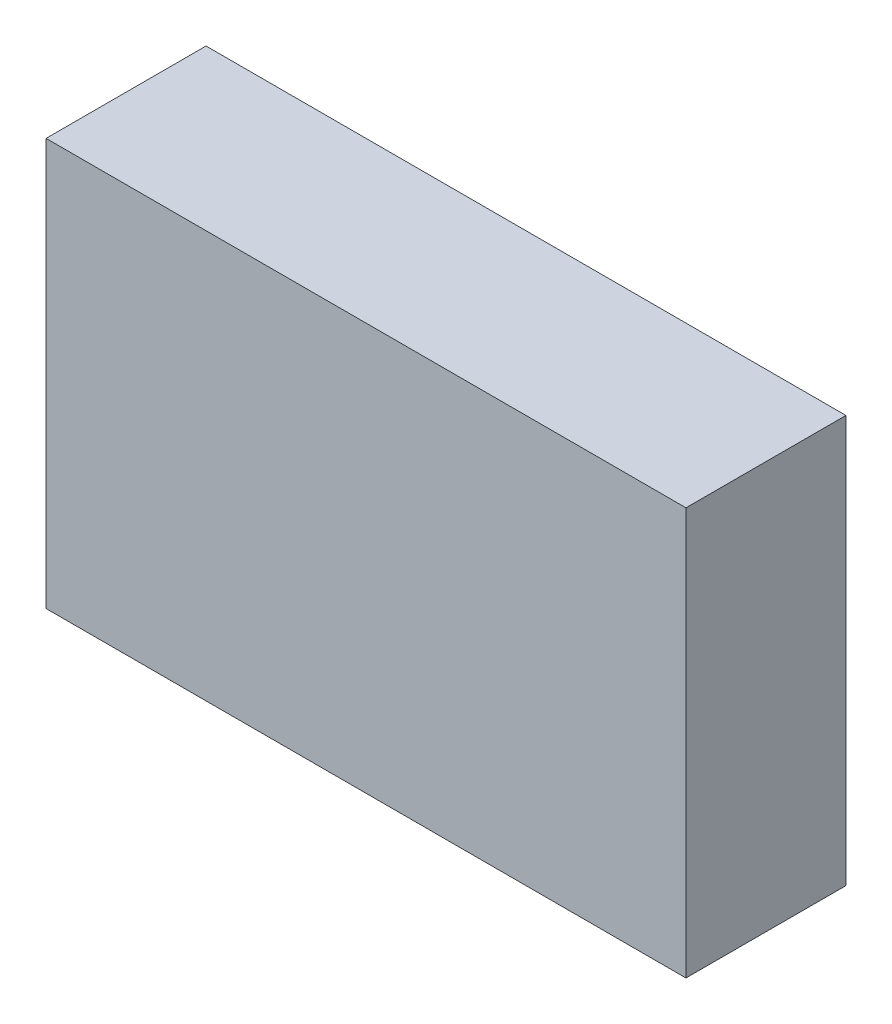
ISO-10303-21;
HEADER;
FILE_DESCRIPTION(('STEP AP214'),'2;1');
FILE_NAME('part.step','',(''),(''),'','','');
FILE_SCHEMA(('AUTOMOTIVE_DESIGN { 1 0 10303 214 1 1 1 1 }'));
ENDSEC;
DATA;
#1=APPLICATION_CONTEXT('core data for automotive mechanical design processes');
#2=APPLICATION_PROTOCOL_DEFINITION('international standard','automotive_design',2000,#1);
#3=PRODUCT_CONTEXT('',#1,'mechanical');
#4=PRODUCT('Part','Part','',(#3));
#5=PRODUCT_RELATED_PRODUCT_CATEGORY('part','',(#4));
#6=PRODUCT_DEFINITION_FORMATION('','',#4);
#7=PRODUCT_DEFINITION_CONTEXT('part definition',#1,'design');
#8=PRODUCT_DEFINITION('design','',#6,#7);
#9=PRODUCT_DEFINITION_SHAPE('','',#8);
#10=(LENGTH_UNIT() NAMED_UNIT(*) SI_UNIT(.MILLI.,.METRE.));
#11=(NAMED_UNIT(*) PLANE_ANGLE_UNIT() SI_UNIT($,.RADIAN.));
#12=(NAMED_UNIT(*) SI_UNIT($,.STERADIAN.) SOLID_ANGLE_UNIT());
#13=UNCERTAINTY_MEASURE_WITH_UNIT(LENGTH_MEASURE(1.E-05),#10,'distance_accuracy_value','');
#14=(GEOMETRIC_REPRESENTATION_CONTEXT(3) GLOBAL_UNCERTAINTY_ASSIGNED_CONTEXT((#13)) GLOBAL_UNIT_ASSIGNED_CONTEXT((#10,
#11,#12)) REPRESENTATION_CONTEXT('',''));
#15=CARTESIAN_POINT('',(0.,0.,0.));
#16=DIRECTION('',(0.,0.,1.));
#17=DIRECTION('',(1.,0.,0.));
#18=AXIS2_PLACEMENT_3D('',#15,#16,#17);
#19=CARTESIAN_POINT('',(1.1,-0.7,0.55));
#20=DIRECTION('',(0.,1.,0.));
#21=DIRECTION('',(0.,0.,1.));
#22=AXIS2_PLACEMENT_3D('',#19,#20,#21);
#23=PLANE('',#22);
#24=DIRECTION('',(1.,0.,0.));
#25=VECTOR('',#24,1.);
#26=CARTESIAN_POINT('',(1.1,-0.7,0.));
#27=LINE('',#26,#25);
#28=CARTESIAN_POINT('',(-1.1,-0.7,0.));
#29=VERTEX_POINT('',#28);
#30=CARTESIAN_POINT('',(1.1,-0.7,0.));
#31=VERTEX_POINT('',#30);
#32=EDGE_CURVE('E98',#29,#31,#27,.T.);
#33=ORIENTED_EDGE('',*,*,#32,.T.);
#34=DIRECTION('',(0.,0.,-1.));
#35=VECTOR('',#34,1.);
#36=CARTESIAN_POINT('',(1.1,-0.7,0.55));
#37=LINE('',#36,#35);
#38=CARTESIAN_POINT('',(1.1,-0.7,0.55));
#39=VERTEX_POINT('',#38);
#40=EDGE_CURVE('E11',#39,#31,#37,.T.);
#41=ORIENTED_EDGE('',*,*,#40,.F.);
#42=DIRECTION('',(1.,0.,0.));
#43=VECTOR('',#42,1.);
#44=CARTESIAN_POINT('',(1.1,-0.7,0.55));
#45=LINE('',#44,#43);
#46=CARTESIAN_POINT('',(-1.1,-0.7,0.55));
#47=VERTEX_POINT('',#46);
#48=EDGE_CURVE('E84',#47,#39,#45,.T.);
#49=ORIENTED_EDGE('',*,*,#48,.F.);
#50=DIRECTION('',(0.,0.,-1.));
#51=VECTOR('',#50,1.);
#52=CARTESIAN_POINT('',(-1.1,-0.7,0.55));
#53=LINE('',#52,#51);
#54=EDGE_CURVE('E94',#47,#29,#53,.T.);
#55=ORIENTED_EDGE('',*,*,#54,.T.);
#56=EDGE_LOOP('',(#33,#41,#49,#55));
#57=FACE_BOUND('',#56,.T.);
#58=ADVANCED_FACE('F34',(#57),#23,.F.);
#59=CARTESIAN_POINT('',(1.1,0.7,0.55));
#60=DIRECTION('',(-1.,0.,0.));
#61=DIRECTION('',(0.,0.,1.));
#62=AXIS2_PLACEMENT_3D('',#59,#60,#61);
#63=PLANE('',#62);
#64=DIRECTION('',(0.,1.,0.));
#65=VECTOR('',#64,1.);
#66=CARTESIAN_POINT('',(1.1,0.7,0.));
#67=LINE('',#66,#65);
#68=CARTESIAN_POINT('',(1.1,0.7,0.));
#69=VERTEX_POINT('',#68);
#70=EDGE_CURVE('E89',#31,#69,#67,.T.);
#71=ORIENTED_EDGE('',*,*,#70,.T.);
#72=DIRECTION('',(0.,0.,-1.));
#73=VECTOR('',#72,1.);
#74=CARTESIAN_POINT('',(1.1,0.7,0.55));
#75=LINE('',#74,#73);
#76=CARTESIAN_POINT('',(1.1,0.7,0.55));
#77=VERTEX_POINT('',#76);
#78=EDGE_CURVE('E42',#77,#69,#75,.T.);
#79=ORIENTED_EDGE('',*,*,#78,.F.);
#80=DIRECTION('',(0.,1.,0.));
#81=VECTOR('',#80,1.);
#82=CARTESIAN_POINT('',(1.1,0.7,0.55));
#83=LINE('',#82,#81);
#84=EDGE_CURVE('E78',#39,#77,#83,.T.);
#85=ORIENTED_EDGE('',*,*,#84,.F.);
#86=ORIENTED_EDGE('',*,*,#40,.T.);
#87=EDGE_LOOP('',(#71,#79,#85,#86));
#88=FACE_BOUND('',#87,.T.);
#89=ADVANCED_FACE('F88',(#88),#63,.F.);
#90=CARTESIAN_POINT('',(-1.1,0.7,0.55));
#91=DIRECTION('',(0.,-1.,0.));
#92=DIRECTION('',(0.,0.,-1.));
#93=AXIS2_PLACEMENT_3D('',#90,#91,#92);
#94=PLANE('',#93);
#95=DIRECTION('',(-1.,0.,0.));
#96=VECTOR('',#95,1.);
#97=CARTESIAN_POINT('',(-1.1,0.7,0.));
#98=LINE('',#97,#96);
#99=CARTESIAN_POINT('',(-1.1,0.7,0.));
#100=VERTEX_POINT('',#99);
#101=EDGE_CURVE('E102',#69,#100,#98,.T.);
#102=ORIENTED_EDGE('',*,*,#101,.T.);
#103=DIRECTION('',(0.,0.,-1.));
#104=VECTOR('',#103,1.);
#105=CARTESIAN_POINT('',(-1.1,0.7,0.55));
#106=LINE('',#105,#104);
#107=CARTESIAN_POINT('',(-1.1,0.7,0.55));
#108=VERTEX_POINT('',#107);
#109=EDGE_CURVE('E91',#108,#100,#106,.T.);
#110=ORIENTED_EDGE('',*,*,#109,.F.);
#111=DIRECTION('',(-1.,0.,0.));
#112=VECTOR('',#111,1.);
#113=CARTESIAN_POINT('',(-1.1,0.7,0.55));
#114=LINE('',#113,#112);
#115=EDGE_CURVE('E81',#77,#108,#114,.T.);
#116=ORIENTED_EDGE('',*,*,#115,.F.);
#117=ORIENTED_EDGE('',*,*,#78,.T.);
#118=EDGE_LOOP('',(#102,#110,#116,#117));
#119=FACE_BOUND('',#118,.T.);
#120=ADVANCED_FACE('F92',(#119),#94,.F.);
#121=CARTESIAN_POINT('',(-1.1,-0.7,0.55));
#122=DIRECTION('',(1.,0.,0.));
#123=DIRECTION('',(0.,0.,-1.));
#124=AXIS2_PLACEMENT_3D('',#121,#122,#123);
#125=PLANE('',#124);
#126=DIRECTION('',(0.,-1.,0.));
#127=VECTOR('',#126,1.);
#128=CARTESIAN_POINT('',(-1.1,-0.7,0.));
#129=LINE('',#128,#127);
#130=EDGE_CURVE('E67',#100,#29,#129,.T.);
#131=ORIENTED_EDGE('',*,*,#130,.T.);
#132=ORIENTED_EDGE('',*,*,#54,.F.);
#133=DIRECTION('',(0.,-1.,0.));
#134=VECTOR('',#133,1.);
#135=CARTESIAN_POINT('',(-1.1,0.575,0.55));
#136=LINE('',#135,#134);
#137=EDGE_CURVE('E50',#108,#47,#136,.T.);
#138=ORIENTED_EDGE('',*,*,#137,.F.);
#139=ORIENTED_EDGE('',*,*,#109,.T.);
#140=EDGE_LOOP('',(#131,#132,#138,#139));
#141=FACE_BOUND('',#140,.T.);
#142=ADVANCED_FACE('F106',(#141),#125,.F.);
#143=CARTESIAN_POINT('',(0.,0.,0.55));
#144=DIRECTION('',(0.,0.,-1.));
#145=DIRECTION('',(-1.,0.,0.));
#146=AXIS2_PLACEMENT_3D('',#143,#144,#145);
#147=PLANE('',#146);
#148=ORIENTED_EDGE('',*,*,#48,.T.);
#149=ORIENTED_EDGE('',*,*,#84,.T.);
#150=ORIENTED_EDGE('',*,*,#115,.T.);
#151=ORIENTED_EDGE('',*,*,#137,.T.);
#152=EDGE_LOOP('',(#148,#149,#150,#151));
#153=FACE_BOUND('',#152,.T.);
#154=ADVANCED_FACE('F79',(#153),#147,.F.);
#155=CARTESIAN_POINT('',(0.,0.,0.));
#156=DIRECTION('',(0.,0.,-1.));
#157=DIRECTION('',(-1.,0.,0.));
#158=AXIS2_PLACEMENT_3D('',#155,#156,#157);
#159=PLANE('',#158);
#160=ORIENTED_EDGE('',*,*,#32,.F.);
#161=ORIENTED_EDGE('',*,*,#130,.F.);
#162=ORIENTED_EDGE('',*,*,#101,.F.);
#163=ORIENTED_EDGE('',*,*,#70,.F.);
#164=EDGE_LOOP('',(#160,#161,#162,#163));
#165=FACE_BOUND('',#164,.T.);
#166=ADVANCED_FACE('F108',(#165),#159,.T.);
#167=CLOSED_SHELL('',(#58,#89,#120,#142,#154,#166));
#168=MANIFOLD_SOLID_BREP('B2',#167);
#169=ADVANCED_BREP_SHAPE_REPRESENTATION('',(#18,#168),#14);
#170=SHAPE_DEFINITION_REPRESENTATION(#9,#169);
ENDSEC;
END-ISO-10303-21;
